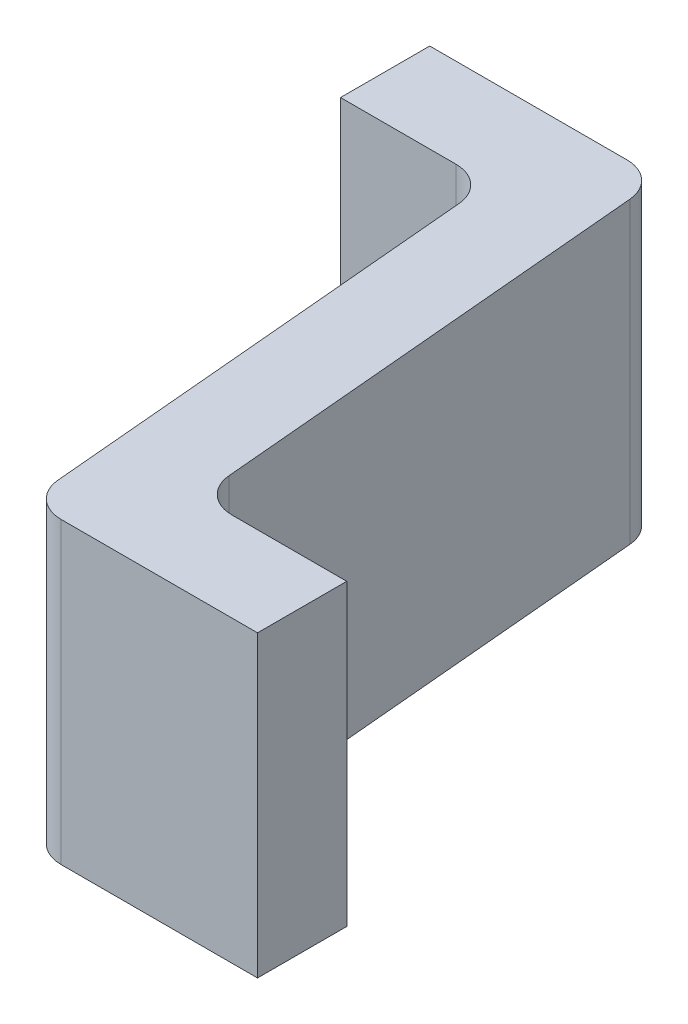
ISO-10303-21;
HEADER;
FILE_DESCRIPTION(('STEP AP214'),'2;1');
FILE_NAME('part.step','',(''),(''),'','','');
FILE_SCHEMA(('AUTOMOTIVE_DESIGN { 1 0 10303 214 1 1 1 1 }'));
ENDSEC;
DATA;
#1=APPLICATION_CONTEXT('core data for automotive mechanical design processes');
#2=APPLICATION_PROTOCOL_DEFINITION('international standard','automotive_design',2000,#1);
#3=PRODUCT_CONTEXT('',#1,'mechanical');
#4=PRODUCT('Part','Part','',(#3));
#5=PRODUCT_RELATED_PRODUCT_CATEGORY('part','',(#4));
#6=PRODUCT_DEFINITION_FORMATION('','',#4);
#7=PRODUCT_DEFINITION_CONTEXT('part definition',#1,'design');
#8=PRODUCT_DEFINITION('design','',#6,#7);
#9=PRODUCT_DEFINITION_SHAPE('','',#8);
#10=(LENGTH_UNIT() NAMED_UNIT(*) SI_UNIT(.MILLI.,.METRE.));
#11=(NAMED_UNIT(*) PLANE_ANGLE_UNIT() SI_UNIT($,.RADIAN.));
#12=(NAMED_UNIT(*) SI_UNIT($,.STERADIAN.) SOLID_ANGLE_UNIT());
#13=UNCERTAINTY_MEASURE_WITH_UNIT(LENGTH_MEASURE(1.E-05),#10,'distance_accuracy_value','');
#14=(GEOMETRIC_REPRESENTATION_CONTEXT(3) GLOBAL_UNCERTAINTY_ASSIGNED_CONTEXT((#13)) GLOBAL_UNIT_ASSIGNED_CONTEXT((#10,
#11,#12)) REPRESENTATION_CONTEXT('',''));
#15=CARTESIAN_POINT('',(0.,0.,0.));
#16=DIRECTION('',(0.,0.,1.));
#17=DIRECTION('',(1.,0.,0.));
#18=AXIS2_PLACEMENT_3D('',#15,#16,#17);
#19=CARTESIAN_POINT('',(53.960831231707,41.650077974907,0.314755357568));
#20=DIRECTION('',(-1.19248806385E-08,1.,0.));
#21=DIRECTION('',(-1.39652092748115E-08,0.,1.));
#22=AXIS2_PLACEMENT_3D('',#19,#20,#21);
#23=PLANE('',#22);
#24=CARTESIAN_POINT('',(53.960831231707,41.650077974907,0.314755357568));
#25=DIRECTION('',(1.19248806385E-08,-1.,0.));
#26=DIRECTION('',(-1.,-1.19248806385E-08,-4.371140919574E-08));
#27=AXIS2_PLACEMENT_3D('',#24,#25,#26);
#28=CIRCLE('',#27,0.0508);
#29=CARTESIAN_POINT('',(53.960831233927,41.650077974907,0.263955357568));
#30=VERTEX_POINT('',#29);
#31=CARTESIAN_POINT('',(54.011432605991,41.650077975511,0.310267493876));
#32=VERTEX_POINT('',#31);
#33=EDGE_CURVE('E217',#30,#32,#28,.T.);
#34=ORIENTED_EDGE('',*,*,#33,.F.);
#35=DIRECTION('',(1.,1.19248806385E-08,4.371140919574E-08));
#36=VECTOR('',#35,1.);
#37=CARTESIAN_POINT('',(53.960831233927,41.650077974907,0.263955357568));
#38=LINE('',#37,#36);
#39=CARTESIAN_POINT('',(53.796438185367,41.650077972947,0.263955350382));
#40=VERTEX_POINT('',#39);
#41=EDGE_CURVE('E26',#40,#30,#38,.T.);
#42=ORIENTED_EDGE('',*,*,#41,.F.);
#43=DIRECTION('',(-4.371140919574E-08,0.,1.));
#44=VECTOR('',#43,1.);
#45=CARTESIAN_POINT('',(53.796438190919,41.650077972947,0.136955350382));
#46=LINE('',#45,#44);
#47=CARTESIAN_POINT('',(53.796438190919,41.650077972947,0.136955350382));
#48=VERTEX_POINT('',#47);
#49=EDGE_CURVE('E193',#48,#40,#46,.T.);
#50=ORIENTED_EDGE('',*,*,#49,.F.);
#51=DIRECTION('',(-1.,-1.19248806385E-08,-4.371140919574E-08));
#52=VECTOR('',#51,1.);
#53=CARTESIAN_POINT('',(54.077066048042,41.650077976293,0.136955362649));
#54=LINE('',#53,#52);
#55=CARTESIAN_POINT('',(54.077066048042,41.650077976293,0.136955362649));
#56=VERTEX_POINT('',#55);
#57=EDGE_CURVE('E224',#56,#48,#54,.T.);
#58=ORIENTED_EDGE('',*,*,#57,.F.);
#59=CARTESIAN_POINT('',(54.077066045822,41.650077976293,0.187755362649));
#60=DIRECTION('',(-1.19248806385E-08,1.,0.));
#61=DIRECTION('',(1.,1.19248806385E-08,4.371140919574E-08));
#62=AXIS2_PLACEMENT_3D('',#59,#60,#61);
#63=CIRCLE('',#62,0.0508);
#64=CARTESIAN_POINT('',(54.127667420106,41.650077976897,0.183267498957));
#65=VERTEX_POINT('',#64);
#66=EDGE_CURVE('E223',#65,#56,#63,.T.);
#67=ORIENTED_EDGE('',*,*,#66,.F.);
#68=DIRECTION('',(-0.0883437734619081,-1.0534891195701E-09,-0.996090044971092));
#69=VECTOR('',#68,1.);
#70=CARTESIAN_POINT('',(54.183205063884,41.650077977559,0.809463233192));
#71=LINE('',#70,#69);
#72=CARTESIAN_POINT('',(54.183205063884,41.650077977559,0.809463233192));
#73=VERTEX_POINT('',#72);
#74=EDGE_CURVE('E20',#73,#65,#71,.T.);
#75=ORIENTED_EDGE('',*,*,#74,.F.);
#76=CARTESIAN_POINT('',(54.233806438169,41.650077978162,0.8049753695));
#77=DIRECTION('',(1.19248806385E-08,-1.,0.));
#78=DIRECTION('',(-1.,-1.19248806385E-08,-4.371140919574E-08));
#79=AXIS2_PLACEMENT_3D('',#76,#77,#78);
#80=CIRCLE('',#79,0.0508);
#81=CARTESIAN_POINT('',(54.233806435948,41.650077978162,0.8557753695));
#82=VERTEX_POINT('',#81);
#83=EDGE_CURVE('E198',#82,#73,#80,.T.);
#84=ORIENTED_EDGE('',*,*,#83,.F.);
#85=DIRECTION('',(-1.,-1.19248806385E-08,-4.371140919574E-08));
#86=VECTOR('',#85,1.);
#87=CARTESIAN_POINT('',(54.397148159498,41.65007798011,0.85577537664));
#88=LINE('',#87,#86);
#89=CARTESIAN_POINT('',(54.397148159498,41.65007798011,0.85577537664));
#90=VERTEX_POINT('',#89);
#91=EDGE_CURVE('E183',#90,#82,#88,.T.);
#92=ORIENTED_EDGE('',*,*,#91,.F.);
#93=DIRECTION('',(4.371140919574E-08,0.,-1.));
#94=VECTOR('',#93,1.);
#95=CARTESIAN_POINT('',(54.397148159498,41.65007798011,0.85577537664));
#96=LINE('',#95,#94);
#97=CARTESIAN_POINT('',(54.397148153947,41.65007798011,0.98277537664));
#98=VERTEX_POINT('',#97);
#99=EDGE_CURVE('E139',#98,#90,#96,.T.);
#100=ORIENTED_EDGE('',*,*,#99,.F.);
#101=DIRECTION('',(1.,1.19248806385E-08,4.371140919574E-08));
#102=VECTOR('',#101,1.);
#103=CARTESIAN_POINT('',(54.397148153947,41.65007798011,0.98277537664));
#104=LINE('',#103,#102);
#105=CARTESIAN_POINT('',(54.117571621833,41.650077976776,0.982775364419));
#106=VERTEX_POINT('',#105);
#107=EDGE_CURVE('E133',#106,#98,#104,.T.);
#108=ORIENTED_EDGE('',*,*,#107,.F.);
#109=CARTESIAN_POINT('',(54.117571624053,41.650077976776,0.931975364419));
#110=DIRECTION('',(-1.19248806385E-08,1.,0.));
#111=DIRECTION('',(-1.,-1.19248806385E-08,-4.371140919574E-08));
#112=AXIS2_PLACEMENT_3D('',#109,#110,#111);
#113=CIRCLE('',#112,0.0508);
#114=CARTESIAN_POINT('',(54.066970249769,41.650077976173,0.936463228111));
#115=VERTEX_POINT('',#114);
#116=EDGE_CURVE('E136',#115,#106,#113,.T.);
#117=ORIENTED_EDGE('',*,*,#116,.F.);
#118=DIRECTION('',(0.0883437734619081,1.0534891195701E-09,0.996090044971092));
#119=VECTOR('',#118,1.);
#120=CARTESIAN_POINT('',(54.066970249769,41.650077976173,0.936463228111));
#121=LINE('',#120,#119);
#122=EDGE_CURVE('E171',#32,#115,#121,.T.);
#123=ORIENTED_EDGE('',*,*,#122,.F.);
#124=EDGE_LOOP('',(#34,#42,#50,#58,#67,#75,#84,#92,#100,#108,#117,#123));
#125=FACE_BOUND('',#124,.T.);
#126=ADVANCED_FACE('F16',(#125),#23,.F.);
#127=CARTESIAN_POINT('',(53.960831226633,42.075527974907,0.314755357568));
#128=DIRECTION('',(-1.19248806385E-08,1.,0.));
#129=DIRECTION('',(-1.39652092748115E-08,0.,1.));
#130=AXIS2_PLACEMENT_3D('',#127,#128,#129);
#131=PLANE('',#130);
#132=CARTESIAN_POINT('',(53.960831226633,42.075527974907,0.314755357568));
#133=DIRECTION('',(1.19248806385E-08,-1.,0.));
#134=DIRECTION('',(-1.,-1.19248806385E-08,-4.371140919574E-08));
#135=AXIS2_PLACEMENT_3D('',#132,#133,#134);
#136=CIRCLE('',#135,0.0508);
#137=CARTESIAN_POINT('',(53.960831228854,42.075527974907,0.263955357568));
#138=VERTEX_POINT('',#137);
#139=CARTESIAN_POINT('',(54.011432600918,42.075527975511,0.310267493876));
#140=VERTEX_POINT('',#139);
#141=EDGE_CURVE('E216',#138,#140,#136,.T.);
#142=ORIENTED_EDGE('',*,*,#141,.T.);
#143=DIRECTION('',(0.0883437734619081,1.0534891195701E-09,0.996090044971092));
#144=VECTOR('',#143,1.);
#145=CARTESIAN_POINT('',(54.066970244695,42.075527976173,0.936463228111));
#146=LINE('',#145,#144);
#147=CARTESIAN_POINT('',(54.066970244695,42.075527976173,0.936463228111));
#148=VERTEX_POINT('',#147);
#149=EDGE_CURVE('E161',#140,#148,#146,.T.);
#150=ORIENTED_EDGE('',*,*,#149,.T.);
#151=CARTESIAN_POINT('',(54.11757161898,42.075527976776,0.931975364419));
#152=DIRECTION('',(-1.19248806385E-08,1.,0.));
#153=DIRECTION('',(-1.,-1.19248806385E-08,-4.371140919574E-08));
#154=AXIS2_PLACEMENT_3D('',#151,#152,#153);
#155=CIRCLE('',#154,0.0508);
#156=CARTESIAN_POINT('',(54.117571616759,42.075527976776,0.982775364419));
#157=VERTEX_POINT('',#156);
#158=EDGE_CURVE('E145',#148,#157,#155,.T.);
#159=ORIENTED_EDGE('',*,*,#158,.T.);
#160=DIRECTION('',(1.,1.19248806385E-08,4.371140919574E-08));
#161=VECTOR('',#160,1.);
#162=CARTESIAN_POINT('',(54.397148148873,42.07552798011,0.98277537664));
#163=LINE('',#162,#161);
#164=CARTESIAN_POINT('',(54.397148148873,42.07552798011,0.98277537664));
#165=VERTEX_POINT('',#164);
#166=EDGE_CURVE('E151',#157,#165,#163,.T.);
#167=ORIENTED_EDGE('',*,*,#166,.T.);
#168=DIRECTION('',(4.371140919574E-08,0.,-1.));
#169=VECTOR('',#168,1.);
#170=CARTESIAN_POINT('',(54.397148154425,42.07552798011,0.85577537664));
#171=LINE('',#170,#169);
#172=CARTESIAN_POINT('',(54.397148154425,42.07552798011,0.85577537664));
#173=VERTEX_POINT('',#172);
#174=EDGE_CURVE('E179',#165,#173,#171,.T.);
#175=ORIENTED_EDGE('',*,*,#174,.T.);
#176=DIRECTION('',(-1.,-1.19248806385E-08,-4.371140919574E-08));
#177=VECTOR('',#176,1.);
#178=CARTESIAN_POINT('',(54.397148154425,42.07552798011,0.85577537664));
#179=LINE('',#178,#177);
#180=CARTESIAN_POINT('',(54.233806430875,42.075527978162,0.8557753695));
#181=VERTEX_POINT('',#180);
#182=EDGE_CURVE('E203',#173,#181,#179,.T.);
#183=ORIENTED_EDGE('',*,*,#182,.T.);
#184=CARTESIAN_POINT('',(54.233806433095,42.075527978162,0.8049753695));
#185=DIRECTION('',(1.19248806385E-08,-1.,0.));
#186=DIRECTION('',(-1.,-1.19248806385E-08,-4.371140919574E-08));
#187=AXIS2_PLACEMENT_3D('',#184,#185,#186);
#188=CIRCLE('',#187,0.0508);
#189=CARTESIAN_POINT('',(54.183205058811,42.075527977559,0.809463233192));
#190=VERTEX_POINT('',#189);
#191=EDGE_CURVE('E207',#181,#190,#188,.T.);
#192=ORIENTED_EDGE('',*,*,#191,.T.);
#193=DIRECTION('',(-0.0883437734619081,-1.0534891195701E-09,-0.996090044971092));
#194=VECTOR('',#193,1.);
#195=CARTESIAN_POINT('',(54.183205058811,42.075527977559,0.809463233192));
#196=LINE('',#195,#194);
#197=CARTESIAN_POINT('',(54.127667415033,42.075527976897,0.183267498957));
#198=VERTEX_POINT('',#197);
#199=EDGE_CURVE('E188',#190,#198,#196,.T.);
#200=ORIENTED_EDGE('',*,*,#199,.T.);
#201=CARTESIAN_POINT('',(54.077066040748,42.075527976293,0.187755362649));
#202=DIRECTION('',(-1.19248806385E-08,1.,0.));
#203=DIRECTION('',(1.,1.19248806385E-08,4.371140919574E-08));
#204=AXIS2_PLACEMENT_3D('',#201,#202,#203);
#205=CIRCLE('',#204,0.0508);
#206=CARTESIAN_POINT('',(54.077066042969,42.075527976293,0.136955362649));
#207=VERTEX_POINT('',#206);
#208=EDGE_CURVE('E222',#198,#207,#205,.T.);
#209=ORIENTED_EDGE('',*,*,#208,.T.);
#210=DIRECTION('',(-1.,-1.19248806385E-08,-4.371140919574E-08));
#211=VECTOR('',#210,1.);
#212=CARTESIAN_POINT('',(54.077066042969,42.075527976293,0.136955362649));
#213=LINE('',#212,#211);
#214=CARTESIAN_POINT('',(53.796438185845,42.075527972947,0.136955350382));
#215=VERTEX_POINT('',#214);
#216=EDGE_CURVE('E197',#207,#215,#213,.T.);
#217=ORIENTED_EDGE('',*,*,#216,.T.);
#218=DIRECTION('',(-4.371140919574E-08,0.,1.));
#219=VECTOR('',#218,1.);
#220=CARTESIAN_POINT('',(53.796438185845,42.075527972947,0.136955350382));
#221=LINE('',#220,#219);
#222=CARTESIAN_POINT('',(53.796438180294,42.075527972947,0.263955350382));
#223=VERTEX_POINT('',#222);
#224=EDGE_CURVE('E189',#215,#223,#221,.T.);
#225=ORIENTED_EDGE('',*,*,#224,.T.);
#226=DIRECTION('',(1.,1.19248806385E-08,4.371140919574E-08));
#227=VECTOR('',#226,1.);
#228=CARTESIAN_POINT('',(53.960831228854,42.075527974907,0.263955357568));
#229=LINE('',#228,#227);
#230=EDGE_CURVE('E11',#223,#138,#229,.T.);
#231=ORIENTED_EDGE('',*,*,#230,.T.);
#232=EDGE_LOOP('',(#142,#150,#159,#167,#175,#183,#192,#200,#209,#217,#225,#231));
#233=FACE_BOUND('',#232,.T.);
#234=ADVANCED_FACE('F18',(#233),#131,.T.);
#235=CARTESIAN_POINT('',(53.960831228854,42.075527974907,0.263955357568));
#236=DIRECTION('',(4.371140919574E-08,0.,-1.));
#237=DIRECTION('',(0.,-1.,0.));
#238=AXIS2_PLACEMENT_3D('',#235,#236,#237);
#239=PLANE('',#238);
#240=ORIENTED_EDGE('',*,*,#41,.T.);
#241=DIRECTION('',(1.19248806385E-08,-1.,0.));
#242=VECTOR('',#241,1.);
#243=CARTESIAN_POINT('',(53.960831228854,42.075527974907,0.263955357568));
#244=LINE('',#243,#242);
#245=EDGE_CURVE('E173',#138,#30,#244,.T.);
#246=ORIENTED_EDGE('',*,*,#245,.F.);
#247=ORIENTED_EDGE('',*,*,#230,.F.);
#248=DIRECTION('',(1.19248806385E-08,-1.,0.));
#249=VECTOR('',#248,1.);
#250=CARTESIAN_POINT('',(53.796438180294,42.075527972947,0.263955350382));
#251=LINE('',#250,#249);
#252=EDGE_CURVE('E192',#223,#40,#251,.T.);
#253=ORIENTED_EDGE('',*,*,#252,.T.);
#254=EDGE_LOOP('',(#240,#246,#247,#253));
#255=FACE_BOUND('',#254,.T.);
#256=ADVANCED_FACE('F246',(#255),#239,.F.);
#257=CARTESIAN_POINT('',(53.796438185845,42.075527972947,0.136955350382));
#258=DIRECTION('',(1.,1.19248806385E-08,4.371140919574E-08));
#259=DIRECTION('',(0.,-0.964743720743124,0.263191096518694));
#260=AXIS2_PLACEMENT_3D('',#257,#258,#259);
#261=PLANE('',#260);
#262=ORIENTED_EDGE('',*,*,#49,.T.);
#263=ORIENTED_EDGE('',*,*,#252,.F.);
#264=ORIENTED_EDGE('',*,*,#224,.F.);
#265=DIRECTION('',(1.19248806385E-08,-1.,0.));
#266=VECTOR('',#265,1.);
#267=CARTESIAN_POINT('',(53.796438185845,42.075527972947,0.136955350382));
#268=LINE('',#267,#266);
#269=EDGE_CURVE('E228',#215,#48,#268,.T.);
#270=ORIENTED_EDGE('',*,*,#269,.T.);
#271=EDGE_LOOP('',(#262,#263,#264,#270));
#272=FACE_BOUND('',#271,.T.);
#273=ADVANCED_FACE('F248',(#272),#261,.F.);
#274=CARTESIAN_POINT('',(54.077066042969,42.075527976293,0.136955362649));
#275=DIRECTION('',(-4.371140919574E-08,0.,1.));
#276=DIRECTION('',(-8.11504113074374E-09,1.,0.));
#277=AXIS2_PLACEMENT_3D('',#274,#275,#276);
#278=PLANE('',#277);
#279=ORIENTED_EDGE('',*,*,#57,.T.);
#280=ORIENTED_EDGE('',*,*,#269,.F.);
#281=ORIENTED_EDGE('',*,*,#216,.F.);
#282=DIRECTION('',(1.19248806385E-08,-1.,0.));
#283=VECTOR('',#282,1.);
#284=CARTESIAN_POINT('',(54.077066042969,42.075527976293,0.136955362649));
#285=LINE('',#284,#283);
#286=EDGE_CURVE('E218',#207,#56,#285,.T.);
#287=ORIENTED_EDGE('',*,*,#286,.T.);
#288=EDGE_LOOP('',(#279,#280,#281,#287));
#289=FACE_BOUND('',#288,.T.);
#290=ADVANCED_FACE('F253',(#289),#278,.F.);
#291=CARTESIAN_POINT('',(54.077066040748,42.075527976293,0.187755362649));
#292=DIRECTION('',(1.19248806385E-08,-1.,0.));
#293=DIRECTION('',(1.,1.19248806385E-08,4.371140919574E-08));
#294=AXIS2_PLACEMENT_3D('',#291,#292,#293);
#295=CYLINDRICAL_SURFACE('',#294,0.0508);
#296=ORIENTED_EDGE('',*,*,#66,.T.);
#297=ORIENTED_EDGE('',*,*,#286,.F.);
#298=ORIENTED_EDGE('',*,*,#208,.F.);
#299=DIRECTION('',(1.19248806385E-08,-1.,0.));
#300=VECTOR('',#299,1.);
#301=CARTESIAN_POINT('',(54.127667415033,42.075527976897,0.183267498957));
#302=LINE('',#301,#300);
#303=EDGE_CURVE('E184',#198,#65,#302,.T.);
#304=ORIENTED_EDGE('',*,*,#303,.T.);
#305=EDGE_LOOP('',(#296,#297,#298,#304));
#306=FACE_BOUND('',#305,.T.);
#307=ADVANCED_FACE('F256',(#306),#295,.T.);
#308=CARTESIAN_POINT('',(54.183205058811,42.075527977559,0.809463233192));
#309=DIRECTION('',(-0.996090044971091,-1.18782548767711E-08,0.0883437734619081));
#310=DIRECTION('',(-1.1924880623735E-08,1.,0.));
#311=AXIS2_PLACEMENT_3D('',#308,#309,#310);
#312=PLANE('',#311);
#313=ORIENTED_EDGE('',*,*,#74,.T.);
#314=ORIENTED_EDGE('',*,*,#303,.F.);
#315=ORIENTED_EDGE('',*,*,#199,.F.);
#316=DIRECTION('',(1.19248806385E-08,-1.,0.));
#317=VECTOR('',#316,1.);
#318=CARTESIAN_POINT('',(54.183205058811,42.075527977559,0.809463233192));
#319=LINE('',#318,#317);
#320=EDGE_CURVE('E202',#190,#73,#319,.T.);
#321=ORIENTED_EDGE('',*,*,#320,.T.);
#322=EDGE_LOOP('',(#313,#314,#315,#321));
#323=FACE_BOUND('',#322,.T.);
#324=ADVANCED_FACE('F312',(#323),#312,.F.);
#325=CARTESIAN_POINT('',(54.233806433095,42.075527978162,0.8049753695));
#326=DIRECTION('',(1.19248806385E-08,-1.,0.));
#327=DIRECTION('',(1.,1.19248806385E-08,4.371140919574E-08));
#328=AXIS2_PLACEMENT_3D('',#325,#326,#327);
#329=CYLINDRICAL_SURFACE('',#328,0.0508);
#330=ORIENTED_EDGE('',*,*,#83,.T.);
#331=ORIENTED_EDGE('',*,*,#320,.F.);
#332=ORIENTED_EDGE('',*,*,#191,.F.);
#333=DIRECTION('',(1.19248806385E-08,-1.,0.));
#334=VECTOR('',#333,1.);
#335=CARTESIAN_POINT('',(54.233806430875,42.075527978162,0.8557753695));
#336=LINE('',#335,#334);
#337=EDGE_CURVE('E270',#181,#82,#336,.T.);
#338=ORIENTED_EDGE('',*,*,#337,.T.);
#339=EDGE_LOOP('',(#330,#331,#332,#338));
#340=FACE_BOUND('',#339,.T.);
#341=ADVANCED_FACE('F310',(#340),#329,.F.);
#342=CARTESIAN_POINT('',(54.397148154425,42.07552798011,0.85577537664));
#343=DIRECTION('',(-4.371140919574E-08,0.,1.));
#344=DIRECTION('',(-8.11504113074374E-09,1.,0.));
#345=AXIS2_PLACEMENT_3D('',#342,#343,#344);
#346=PLANE('',#345);
#347=ORIENTED_EDGE('',*,*,#91,.T.);
#348=ORIENTED_EDGE('',*,*,#337,.F.);
#349=ORIENTED_EDGE('',*,*,#182,.F.);
#350=DIRECTION('',(1.19248806385E-08,-1.,0.));
#351=VECTOR('',#350,1.);
#352=CARTESIAN_POINT('',(54.397148154425,42.07552798011,0.85577537664));
#353=LINE('',#352,#351);
#354=EDGE_CURVE('E175',#173,#90,#353,.T.);
#355=ORIENTED_EDGE('',*,*,#354,.T.);
#356=EDGE_LOOP('',(#347,#348,#349,#355));
#357=FACE_BOUND('',#356,.T.);
#358=ADVANCED_FACE('F309',(#357),#346,.F.);
#359=CARTESIAN_POINT('',(54.397148154425,42.07552798011,0.85577537664));
#360=DIRECTION('',(-1.,-1.19248806385E-08,-4.371140919574E-08));
#361=DIRECTION('',(-4.371140919574E-08,0.,1.));
#362=AXIS2_PLACEMENT_3D('',#359,#360,#361);
#363=PLANE('',#362);
#364=ORIENTED_EDGE('',*,*,#99,.T.);
#365=ORIENTED_EDGE('',*,*,#354,.F.);
#366=ORIENTED_EDGE('',*,*,#174,.F.);
#367=DIRECTION('',(1.19248806385E-08,-1.,0.));
#368=VECTOR('',#367,1.);
#369=CARTESIAN_POINT('',(54.397148148873,42.07552798011,0.98277537664));
#370=LINE('',#369,#368);
#371=EDGE_CURVE('E144',#165,#98,#370,.T.);
#372=ORIENTED_EDGE('',*,*,#371,.T.);
#373=EDGE_LOOP('',(#364,#365,#366,#372));
#374=FACE_BOUND('',#373,.T.);
#375=ADVANCED_FACE('F445',(#374),#363,.F.);
#376=CARTESIAN_POINT('',(54.397148148873,42.07552798011,0.98277537664));
#377=DIRECTION('',(4.371140919574E-08,0.,-1.));
#378=DIRECTION('',(0.,-1.,0.));
#379=AXIS2_PLACEMENT_3D('',#376,#377,#378);
#380=PLANE('',#379);
#381=ORIENTED_EDGE('',*,*,#107,.T.);
#382=ORIENTED_EDGE('',*,*,#371,.F.);
#383=ORIENTED_EDGE('',*,*,#166,.F.);
#384=DIRECTION('',(1.19248806385E-08,-1.,0.));
#385=VECTOR('',#384,1.);
#386=CARTESIAN_POINT('',(54.117571616759,42.075527976776,0.982775364419));
#387=LINE('',#386,#385);
#388=EDGE_CURVE('E148',#157,#106,#387,.T.);
#389=ORIENTED_EDGE('',*,*,#388,.T.);
#390=EDGE_LOOP('',(#381,#382,#383,#389));
#391=FACE_BOUND('',#390,.T.);
#392=ADVANCED_FACE('F149',(#391),#380,.F.);
#393=CARTESIAN_POINT('',(54.11757161898,42.075527976776,0.931975364419));
#394=DIRECTION('',(1.19248806385E-08,-1.,0.));
#395=DIRECTION('',(1.,1.19248806385E-08,4.371140919574E-08));
#396=AXIS2_PLACEMENT_3D('',#393,#394,#395);
#397=CYLINDRICAL_SURFACE('',#396,0.0508);
#398=ORIENTED_EDGE('',*,*,#116,.T.);
#399=ORIENTED_EDGE('',*,*,#388,.F.);
#400=ORIENTED_EDGE('',*,*,#158,.F.);
#401=DIRECTION('',(1.19248806385E-08,-1.,0.));
#402=VECTOR('',#401,1.);
#403=CARTESIAN_POINT('',(54.066970244695,42.075527976173,0.936463228111));
#404=LINE('',#403,#402);
#405=EDGE_CURVE('E158',#148,#115,#404,.T.);
#406=ORIENTED_EDGE('',*,*,#405,.T.);
#407=EDGE_LOOP('',(#398,#399,#400,#406));
#408=FACE_BOUND('',#407,.T.);
#409=ADVANCED_FACE('F156',(#408),#397,.T.);
#410=CARTESIAN_POINT('',(54.066970244695,42.075527976173,0.936463228111));
#411=DIRECTION('',(0.996090044971091,1.18782548767711E-08,-0.0883437734619081));
#412=DIRECTION('',(0.,-1.,-1.34454918680745E-07));
#413=AXIS2_PLACEMENT_3D('',#410,#411,#412);
#414=PLANE('',#413);
#415=ORIENTED_EDGE('',*,*,#122,.T.);
#416=ORIENTED_EDGE('',*,*,#405,.F.);
#417=ORIENTED_EDGE('',*,*,#149,.F.);
#418=DIRECTION('',(1.19248806385E-08,-1.,0.));
#419=VECTOR('',#418,1.);
#420=CARTESIAN_POINT('',(54.011432600918,42.075527975511,0.310267493876));
#421=LINE('',#420,#419);
#422=EDGE_CURVE('E212',#140,#32,#421,.T.);
#423=ORIENTED_EDGE('',*,*,#422,.T.);
#424=EDGE_LOOP('',(#415,#416,#417,#423));
#425=FACE_BOUND('',#424,.T.);
#426=ADVANCED_FACE('F285',(#425),#414,.F.);
#427=CARTESIAN_POINT('',(53.960831226633,42.075527974907,0.314755357568));
#428=DIRECTION('',(1.19248806385E-08,-1.,0.));
#429=DIRECTION('',(1.,1.19248806385E-08,4.371140919574E-08));
#430=AXIS2_PLACEMENT_3D('',#427,#428,#429);
#431=CYLINDRICAL_SURFACE('',#430,0.0508);
#432=ORIENTED_EDGE('',*,*,#33,.T.);
#433=ORIENTED_EDGE('',*,*,#422,.F.);
#434=ORIENTED_EDGE('',*,*,#141,.F.);
#435=ORIENTED_EDGE('',*,*,#245,.T.);
#436=EDGE_LOOP('',(#432,#433,#434,#435));
#437=FACE_BOUND('',#436,.T.);
#438=ADVANCED_FACE('F283',(#437),#431,.F.);
#439=CLOSED_SHELL('',(#126,#234,#256,#273,#290,#307,#324,#341,#358,#375,#392,#409,#426,#438));
#440=MANIFOLD_SOLID_BREP('B1',#439);
#441=ADVANCED_BREP_SHAPE_REPRESENTATION('',(#18,#440),#14);
#442=SHAPE_DEFINITION_REPRESENTATION(#9,#441);
ENDSEC;
END-ISO-10303-21;
